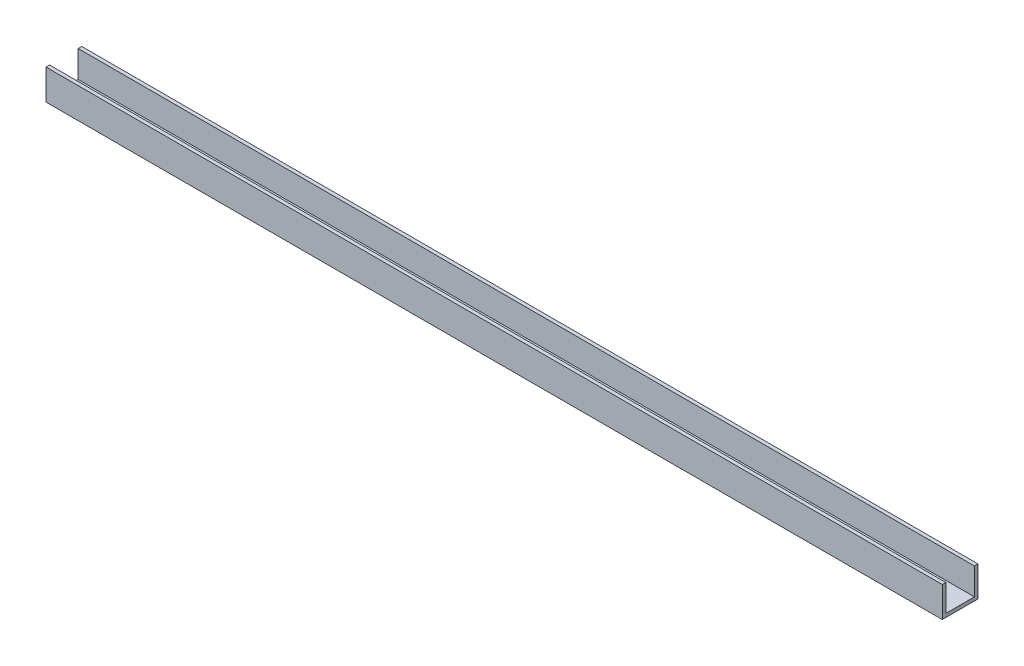
ISO-10303-21;
HEADER;
FILE_DESCRIPTION(('STEP AP214'),'2;1');
FILE_NAME('part.step','',(''),(''),'','','');
FILE_SCHEMA(('AUTOMOTIVE_DESIGN { 1 0 10303 214 1 1 1 1 }'));
ENDSEC;
DATA;
#1=APPLICATION_CONTEXT('core data for automotive mechanical design processes');
#2=APPLICATION_PROTOCOL_DEFINITION('international standard','automotive_design',2000,#1);
#3=PRODUCT_CONTEXT('',#1,'mechanical');
#4=PRODUCT('Part','Part','',(#3));
#5=PRODUCT_RELATED_PRODUCT_CATEGORY('part','',(#4));
#6=PRODUCT_DEFINITION_FORMATION('','',#4);
#7=PRODUCT_DEFINITION_CONTEXT('part definition',#1,'design');
#8=PRODUCT_DEFINITION('design','',#6,#7);
#9=PRODUCT_DEFINITION_SHAPE('','',#8);
#10=(LENGTH_UNIT() NAMED_UNIT(*) SI_UNIT(.MILLI.,.METRE.));
#11=(NAMED_UNIT(*) PLANE_ANGLE_UNIT() SI_UNIT($,.RADIAN.));
#12=(NAMED_UNIT(*) SI_UNIT($,.STERADIAN.) SOLID_ANGLE_UNIT());
#13=UNCERTAINTY_MEASURE_WITH_UNIT(LENGTH_MEASURE(1.E-05),#10,'distance_accuracy_value','');
#14=(GEOMETRIC_REPRESENTATION_CONTEXT(3) GLOBAL_UNCERTAINTY_ASSIGNED_CONTEXT((#13)) GLOBAL_UNIT_ASSIGNED_CONTEXT((#10,
#11,#12)) REPRESENTATION_CONTEXT('',''));
#15=CARTESIAN_POINT('',(0.,0.,0.));
#16=DIRECTION('',(0.,0.,1.));
#17=DIRECTION('',(1.,0.,0.));
#18=AXIS2_PLACEMENT_3D('',#15,#16,#17);
#19=CARTESIAN_POINT('',(251.,4.25,4.));
#20=DIRECTION('',(0.,-1.,0.));
#21=DIRECTION('',(0.,0.,-1.));
#22=AXIS2_PLACEMENT_3D('',#19,#20,#21);
#23=PLANE('',#22);
#24=DIRECTION('',(0.,0.,1.));
#25=VECTOR('',#24,1.);
#26=CARTESIAN_POINT('',(0.,4.25,4.));
#27=LINE('',#26,#25);
#28=CARTESIAN_POINT('',(0.,4.25,4.));
#29=VERTEX_POINT('',#28);
#30=CARTESIAN_POINT('',(0.,4.25,5.));
#31=VERTEX_POINT('',#30);
#32=EDGE_CURVE('E126',#29,#31,#27,.T.);
#33=ORIENTED_EDGE('',*,*,#32,.T.);
#34=DIRECTION('',(-1.,0.,0.));
#35=VECTOR('',#34,1.);
#36=CARTESIAN_POINT('',(251.,4.25,5.));
#37=LINE('',#36,#35);
#38=CARTESIAN_POINT('',(251.,4.25,5.));
#39=VERTEX_POINT('',#38);
#40=EDGE_CURVE('E11',#39,#31,#37,.T.);
#41=ORIENTED_EDGE('',*,*,#40,.F.);
#42=DIRECTION('',(0.,0.,1.));
#43=VECTOR('',#42,1.);
#44=CARTESIAN_POINT('',(251.,4.25,4.));
#45=LINE('',#44,#43);
#46=CARTESIAN_POINT('',(251.,4.25,4.));
#47=VERTEX_POINT('',#46);
#48=EDGE_CURVE('E141',#47,#39,#45,.T.);
#49=ORIENTED_EDGE('',*,*,#48,.F.);
#50=DIRECTION('',(-1.,0.,0.));
#51=VECTOR('',#50,1.);
#52=CARTESIAN_POINT('',(251.,4.25,4.));
#53=LINE('',#52,#51);
#54=EDGE_CURVE('E122',#47,#29,#53,.T.);
#55=ORIENTED_EDGE('',*,*,#54,.T.);
#56=EDGE_LOOP('',(#33,#41,#49,#55));
#57=FACE_BOUND('',#56,.T.);
#58=ADVANCED_FACE('F30',(#57),#23,.F.);
#59=CARTESIAN_POINT('',(251.,-4.25,5.));
#60=DIRECTION('',(0.,0.,-1.));
#61=DIRECTION('',(-1.,0.,0.));
#62=AXIS2_PLACEMENT_3D('',#59,#60,#61);
#63=PLANE('',#62);
#64=DIRECTION('',(0.,-1.,0.));
#65=VECTOR('',#64,1.);
#66=CARTESIAN_POINT('',(0.,-4.25,5.));
#67=LINE('',#66,#65);
#68=CARTESIAN_POINT('',(0.,-4.25,5.));
#69=VERTEX_POINT('',#68);
#70=EDGE_CURVE('E129',#31,#69,#67,.T.);
#71=ORIENTED_EDGE('',*,*,#70,.T.);
#72=DIRECTION('',(-1.,0.,0.));
#73=VECTOR('',#72,1.);
#74=CARTESIAN_POINT('',(251.,-4.25,5.));
#75=LINE('',#74,#73);
#76=CARTESIAN_POINT('',(251.,-4.25,5.));
#77=VERTEX_POINT('',#76);
#78=EDGE_CURVE('E38',#77,#69,#75,.T.);
#79=ORIENTED_EDGE('',*,*,#78,.F.);
#80=DIRECTION('',(0.,-1.,0.));
#81=VECTOR('',#80,1.);
#82=CARTESIAN_POINT('',(251.,-4.25,5.));
#83=LINE('',#82,#81);
#84=EDGE_CURVE('E89',#39,#77,#83,.T.);
#85=ORIENTED_EDGE('',*,*,#84,.F.);
#86=ORIENTED_EDGE('',*,*,#40,.T.);
#87=EDGE_LOOP('',(#71,#79,#85,#86));
#88=FACE_BOUND('',#87,.T.);
#89=ADVANCED_FACE('F233',(#88),#63,.F.);
#90=CARTESIAN_POINT('',(251.,-4.25,-5.));
#91=DIRECTION('',(0.,1.,0.));
#92=DIRECTION('',(0.,0.,1.));
#93=AXIS2_PLACEMENT_3D('',#90,#91,#92);
#94=PLANE('',#93);
#95=CARTESIAN_POINT('',(215.,-4.25,0.));
#96=DIRECTION('',(0.,-1.,0.));
#97=DIRECTION('',(0.,0.,-1.));
#98=AXIS2_PLACEMENT_3D('',#95,#96,#97);
#99=CIRCLE('',#98,2.5);
#100=CARTESIAN_POINT('',(215.,-4.25,-2.49999999999999));
#101=VERTEX_POINT('',#100);
#102=EDGE_CURVE('E224',#101,#101,#99,.T.);
#103=ORIENTED_EDGE('',*,*,#102,.F.);
#104=EDGE_LOOP('',(#103));
#105=FACE_BOUND('',#104,.T.);
#106=CARTESIAN_POINT('',(223.5,-4.25,0.));
#107=DIRECTION('',(0.,-1.,0.));
#108=DIRECTION('',(0.,0.,-1.));
#109=AXIS2_PLACEMENT_3D('',#106,#107,#108);
#110=CIRCLE('',#109,2.5);
#111=CARTESIAN_POINT('',(223.5,-4.25,-2.49999999999999));
#112=VERTEX_POINT('',#111);
#113=EDGE_CURVE('E218',#112,#112,#110,.T.);
#114=ORIENTED_EDGE('',*,*,#113,.F.);
#115=EDGE_LOOP('',(#114));
#116=FACE_BOUND('',#115,.T.);
#117=CARTESIAN_POINT('',(232.,-4.25,0.));
#118=DIRECTION('',(0.,-1.,0.));
#119=DIRECTION('',(0.,0.,-1.));
#120=AXIS2_PLACEMENT_3D('',#117,#118,#119);
#121=CIRCLE('',#120,2.5);
#122=CARTESIAN_POINT('',(232.,-4.25,-2.49999999999999));
#123=VERTEX_POINT('',#122);
#124=EDGE_CURVE('E212',#123,#123,#121,.T.);
#125=ORIENTED_EDGE('',*,*,#124,.F.);
#126=EDGE_LOOP('',(#125));
#127=FACE_BOUND('',#126,.T.);
#128=CARTESIAN_POINT('',(132.,-4.25,0.));
#129=DIRECTION('',(0.,-1.,0.));
#130=DIRECTION('',(0.,0.,-1.));
#131=AXIS2_PLACEMENT_3D('',#128,#129,#130);
#132=CIRCLE('',#131,2.5);
#133=CARTESIAN_POINT('',(132.,-4.25,-2.5));
#134=VERTEX_POINT('',#133);
#135=EDGE_CURVE('E206',#134,#134,#132,.T.);
#136=ORIENTED_EDGE('',*,*,#135,.F.);
#137=EDGE_LOOP('',(#136));
#138=FACE_BOUND('',#137,.T.);
#139=CARTESIAN_POINT('',(123.5,-4.25,0.));
#140=DIRECTION('',(0.,-1.,0.));
#141=DIRECTION('',(0.,0.,-1.));
#142=AXIS2_PLACEMENT_3D('',#139,#140,#141);
#143=CIRCLE('',#142,2.49999999999997);
#144=CARTESIAN_POINT('',(123.5,-4.25,-2.49999999999997));
#145=VERTEX_POINT('',#144);
#146=EDGE_CURVE('E200',#145,#145,#143,.T.);
#147=ORIENTED_EDGE('',*,*,#146,.F.);
#148=EDGE_LOOP('',(#147));
#149=FACE_BOUND('',#148,.T.);
#150=CARTESIAN_POINT('',(115.,-4.25,0.));
#151=DIRECTION('',(0.,-1.,0.));
#152=DIRECTION('',(0.,0.,-1.));
#153=AXIS2_PLACEMENT_3D('',#150,#151,#152);
#154=CIRCLE('',#153,2.50000000000001);
#155=CARTESIAN_POINT('',(115.,-4.25,-2.50000000000001));
#156=VERTEX_POINT('',#155);
#157=EDGE_CURVE('E194',#156,#156,#154,.T.);
#158=ORIENTED_EDGE('',*,*,#157,.F.);
#159=EDGE_LOOP('',(#158));
#160=FACE_BOUND('',#159,.T.);
#161=CARTESIAN_POINT('',(36.,-4.25,0.));
#162=DIRECTION('',(0.,-1.,0.));
#163=DIRECTION('',(0.,0.,-1.));
#164=AXIS2_PLACEMENT_3D('',#161,#162,#163);
#165=CIRCLE('',#164,2.5);
#166=CARTESIAN_POINT('',(36.,-4.25,-2.5));
#167=VERTEX_POINT('',#166);
#168=EDGE_CURVE('E188',#167,#167,#165,.T.);
#169=ORIENTED_EDGE('',*,*,#168,.F.);
#170=EDGE_LOOP('',(#169));
#171=FACE_BOUND('',#170,.T.);
#172=CARTESIAN_POINT('',(27.5,-4.25,0.));
#173=DIRECTION('',(0.,-1.,0.));
#174=DIRECTION('',(0.,0.,-1.));
#175=AXIS2_PLACEMENT_3D('',#172,#173,#174);
#176=CIRCLE('',#175,2.5);
#177=CARTESIAN_POINT('',(27.5,-4.25,-2.5));
#178=VERTEX_POINT('',#177);
#179=EDGE_CURVE('E182',#178,#178,#176,.T.);
#180=ORIENTED_EDGE('',*,*,#179,.F.);
#181=EDGE_LOOP('',(#180));
#182=FACE_BOUND('',#181,.T.);
#183=CARTESIAN_POINT('',(19.,-4.25,0.));
#184=DIRECTION('',(0.,-1.,0.));
#185=DIRECTION('',(0.,0.,-1.));
#186=AXIS2_PLACEMENT_3D('',#183,#184,#185);
#187=CIRCLE('',#186,2.5);
#188=CARTESIAN_POINT('',(19.,-4.25,-2.5));
#189=VERTEX_POINT('',#188);
#190=EDGE_CURVE('E176',#189,#189,#187,.T.);
#191=ORIENTED_EDGE('',*,*,#190,.F.);
#192=EDGE_LOOP('',(#191));
#193=FACE_BOUND('',#192,.T.);
#194=DIRECTION('',(0.,0.,-1.));
#195=VECTOR('',#194,1.);
#196=CARTESIAN_POINT('',(0.,-4.25,-5.));
#197=LINE('',#196,#195);
#198=CARTESIAN_POINT('',(0.,-4.25,-5.));
#199=VERTEX_POINT('',#198);
#200=EDGE_CURVE('E132',#69,#199,#197,.T.);
#201=ORIENTED_EDGE('',*,*,#200,.T.);
#202=DIRECTION('',(-1.,0.,0.));
#203=VECTOR('',#202,1.);
#204=CARTESIAN_POINT('',(251.,-4.25,-5.));
#205=LINE('',#204,#203);
#206=CARTESIAN_POINT('',(251.,-4.25,-5.));
#207=VERTEX_POINT('',#206);
#208=EDGE_CURVE('E148',#207,#199,#205,.T.);
#209=ORIENTED_EDGE('',*,*,#208,.F.);
#210=DIRECTION('',(0.,0.,-1.));
#211=VECTOR('',#210,1.);
#212=CARTESIAN_POINT('',(251.,-4.25,-5.));
#213=LINE('',#212,#211);
#214=EDGE_CURVE('E156',#77,#207,#213,.T.);
#215=ORIENTED_EDGE('',*,*,#214,.F.);
#216=ORIENTED_EDGE('',*,*,#78,.T.);
#217=EDGE_LOOP('',(#201,#209,#215,#216));
#218=FACE_BOUND('',#217,.T.);
#219=ADVANCED_FACE('F154',(#105,#116,#127,#138,#149,#160,#171,#182,#193,#218),#94,.F.);
#220=CARTESIAN_POINT('',(251.,-4.25,-5.));
#221=DIRECTION('',(0.,0.,1.));
#222=DIRECTION('',(1.,0.,0.));
#223=AXIS2_PLACEMENT_3D('',#220,#221,#222);
#224=PLANE('',#223);
#225=DIRECTION('',(0.,1.,0.));
#226=VECTOR('',#225,1.);
#227=CARTESIAN_POINT('',(0.,-4.25,-5.));
#228=LINE('',#227,#226);
#229=CARTESIAN_POINT('',(0.,4.25,-5.));
#230=VERTEX_POINT('',#229);
#231=EDGE_CURVE('E134',#199,#230,#228,.T.);
#232=ORIENTED_EDGE('',*,*,#231,.T.);
#233=DIRECTION('',(-1.,0.,0.));
#234=VECTOR('',#233,1.);
#235=CARTESIAN_POINT('',(251.,4.25,-5.));
#236=LINE('',#235,#234);
#237=CARTESIAN_POINT('',(251.,4.25,-5.));
#238=VERTEX_POINT('',#237);
#239=EDGE_CURVE('E145',#238,#230,#236,.T.);
#240=ORIENTED_EDGE('',*,*,#239,.F.);
#241=DIRECTION('',(0.,1.,0.));
#242=VECTOR('',#241,1.);
#243=CARTESIAN_POINT('',(251.,-4.25,-5.));
#244=LINE('',#243,#242);
#245=EDGE_CURVE('E168',#207,#238,#244,.T.);
#246=ORIENTED_EDGE('',*,*,#245,.F.);
#247=ORIENTED_EDGE('',*,*,#208,.T.);
#248=EDGE_LOOP('',(#232,#240,#246,#247));
#249=FACE_BOUND('',#248,.T.);
#250=ADVANCED_FACE('F164',(#249),#224,.F.);
#251=CARTESIAN_POINT('',(251.,4.25,-5.));
#252=DIRECTION('',(0.,-1.,0.));
#253=DIRECTION('',(0.,0.,-1.));
#254=AXIS2_PLACEMENT_3D('',#251,#252,#253);
#255=PLANE('',#254);
#256=DIRECTION('',(0.,0.,1.));
#257=VECTOR('',#256,1.);
#258=CARTESIAN_POINT('',(0.,4.25,-5.));
#259=LINE('',#258,#257);
#260=CARTESIAN_POINT('',(0.,4.25,-4.));
#261=VERTEX_POINT('',#260);
#262=EDGE_CURVE('E136',#230,#261,#259,.T.);
#263=ORIENTED_EDGE('',*,*,#262,.T.);
#264=DIRECTION('',(-1.,0.,0.));
#265=VECTOR('',#264,1.);
#266=CARTESIAN_POINT('',(251.,4.25,-4.));
#267=LINE('',#266,#265);
#268=CARTESIAN_POINT('',(251.,4.25,-4.));
#269=VERTEX_POINT('',#268);
#270=EDGE_CURVE('E117',#269,#261,#267,.T.);
#271=ORIENTED_EDGE('',*,*,#270,.F.);
#272=DIRECTION('',(0.,0.,1.));
#273=VECTOR('',#272,1.);
#274=CARTESIAN_POINT('',(251.,4.25,-5.));
#275=LINE('',#274,#273);
#276=EDGE_CURVE('E108',#238,#269,#275,.T.);
#277=ORIENTED_EDGE('',*,*,#276,.F.);
#278=ORIENTED_EDGE('',*,*,#239,.T.);
#279=EDGE_LOOP('',(#263,#271,#277,#278));
#280=FACE_BOUND('',#279,.T.);
#281=ADVANCED_FACE('F167',(#280),#255,.F.);
#282=CARTESIAN_POINT('',(251.,-3.25,-4.));
#283=DIRECTION('',(0.,0.,-1.));
#284=DIRECTION('',(-1.,0.,0.));
#285=AXIS2_PLACEMENT_3D('',#282,#283,#284);
#286=PLANE('',#285);
#287=DIRECTION('',(0.,-1.,0.));
#288=VECTOR('',#287,1.);
#289=CARTESIAN_POINT('',(0.,-3.25,-4.));
#290=LINE('',#289,#288);
#291=CARTESIAN_POINT('',(0.,-3.25,-4.));
#292=VERTEX_POINT('',#291);
#293=EDGE_CURVE('E116',#261,#292,#290,.T.);
#294=ORIENTED_EDGE('',*,*,#293,.T.);
#295=DIRECTION('',(-1.,0.,0.));
#296=VECTOR('',#295,1.);
#297=CARTESIAN_POINT('',(251.,-3.25,-4.));
#298=LINE('',#297,#296);
#299=CARTESIAN_POINT('',(251.,-3.25,-4.));
#300=VERTEX_POINT('',#299);
#301=EDGE_CURVE('E113',#300,#292,#298,.T.);
#302=ORIENTED_EDGE('',*,*,#301,.F.);
#303=DIRECTION('',(0.,-1.,0.));
#304=VECTOR('',#303,1.);
#305=CARTESIAN_POINT('',(251.,-3.25,-4.));
#306=LINE('',#305,#304);
#307=EDGE_CURVE('E102',#269,#300,#306,.T.);
#308=ORIENTED_EDGE('',*,*,#307,.F.);
#309=ORIENTED_EDGE('',*,*,#270,.T.);
#310=EDGE_LOOP('',(#294,#302,#308,#309));
#311=FACE_BOUND('',#310,.T.);
#312=ADVANCED_FACE('F114',(#311),#286,.F.);
#313=CARTESIAN_POINT('',(251.,-3.25,4.));
#314=DIRECTION('',(0.,-1.,0.));
#315=DIRECTION('',(0.,0.,-1.));
#316=AXIS2_PLACEMENT_3D('',#313,#314,#315);
#317=PLANE('',#316);
#318=CARTESIAN_POINT('',(215.,-3.25,0.));
#319=DIRECTION('',(0.,-1.,0.));
#320=DIRECTION('',(0.,0.,-1.));
#321=AXIS2_PLACEMENT_3D('',#318,#319,#320);
#322=CIRCLE('',#321,2.5);
#323=CARTESIAN_POINT('',(215.,-3.25,-2.49999999999999));
#324=VERTEX_POINT('',#323);
#325=EDGE_CURVE('E221',#324,#324,#322,.F.);
#326=ORIENTED_EDGE('',*,*,#325,.F.);
#327=EDGE_LOOP('',(#326));
#328=FACE_BOUND('',#327,.T.);
#329=CARTESIAN_POINT('',(223.5,-3.25,0.));
#330=DIRECTION('',(0.,-1.,0.));
#331=DIRECTION('',(0.,0.,-1.));
#332=AXIS2_PLACEMENT_3D('',#329,#330,#331);
#333=CIRCLE('',#332,2.5);
#334=CARTESIAN_POINT('',(223.5,-3.25,-2.49999999999999));
#335=VERTEX_POINT('',#334);
#336=EDGE_CURVE('E215',#335,#335,#333,.F.);
#337=ORIENTED_EDGE('',*,*,#336,.F.);
#338=EDGE_LOOP('',(#337));
#339=FACE_BOUND('',#338,.T.);
#340=CARTESIAN_POINT('',(232.,-3.25,0.));
#341=DIRECTION('',(0.,-1.,0.));
#342=DIRECTION('',(0.,0.,-1.));
#343=AXIS2_PLACEMENT_3D('',#340,#341,#342);
#344=CIRCLE('',#343,2.5);
#345=CARTESIAN_POINT('',(232.,-3.25,-2.49999999999999));
#346=VERTEX_POINT('',#345);
#347=EDGE_CURVE('E209',#346,#346,#344,.F.);
#348=ORIENTED_EDGE('',*,*,#347,.F.);
#349=EDGE_LOOP('',(#348));
#350=FACE_BOUND('',#349,.T.);
#351=CARTESIAN_POINT('',(132.,-3.25,0.));
#352=DIRECTION('',(0.,-1.,0.));
#353=DIRECTION('',(0.,0.,-1.));
#354=AXIS2_PLACEMENT_3D('',#351,#352,#353);
#355=CIRCLE('',#354,2.5);
#356=CARTESIAN_POINT('',(132.,-3.25,-2.5));
#357=VERTEX_POINT('',#356);
#358=EDGE_CURVE('E203',#357,#357,#355,.F.);
#359=ORIENTED_EDGE('',*,*,#358,.F.);
#360=EDGE_LOOP('',(#359));
#361=FACE_BOUND('',#360,.T.);
#362=CARTESIAN_POINT('',(123.5,-3.25,0.));
#363=DIRECTION('',(0.,-1.,0.));
#364=DIRECTION('',(0.,0.,-1.));
#365=AXIS2_PLACEMENT_3D('',#362,#363,#364);
#366=CIRCLE('',#365,2.49999999999997);
#367=CARTESIAN_POINT('',(123.5,-3.25,-2.49999999999997));
#368=VERTEX_POINT('',#367);
#369=EDGE_CURVE('E197',#368,#368,#366,.F.);
#370=ORIENTED_EDGE('',*,*,#369,.F.);
#371=EDGE_LOOP('',(#370));
#372=FACE_BOUND('',#371,.T.);
#373=CARTESIAN_POINT('',(115.,-3.25,0.));
#374=DIRECTION('',(0.,-1.,0.));
#375=DIRECTION('',(0.,0.,-1.));
#376=AXIS2_PLACEMENT_3D('',#373,#374,#375);
#377=CIRCLE('',#376,2.50000000000001);
#378=CARTESIAN_POINT('',(115.,-3.25,-2.50000000000001));
#379=VERTEX_POINT('',#378);
#380=EDGE_CURVE('E191',#379,#379,#377,.F.);
#381=ORIENTED_EDGE('',*,*,#380,.F.);
#382=EDGE_LOOP('',(#381));
#383=FACE_BOUND('',#382,.T.);
#384=CARTESIAN_POINT('',(36.,-3.25,0.));
#385=DIRECTION('',(0.,-1.,0.));
#386=DIRECTION('',(0.,0.,-1.));
#387=AXIS2_PLACEMENT_3D('',#384,#385,#386);
#388=CIRCLE('',#387,2.5);
#389=CARTESIAN_POINT('',(36.,-3.25,-2.5));
#390=VERTEX_POINT('',#389);
#391=EDGE_CURVE('E185',#390,#390,#388,.F.);
#392=ORIENTED_EDGE('',*,*,#391,.F.);
#393=EDGE_LOOP('',(#392));
#394=FACE_BOUND('',#393,.T.);
#395=CARTESIAN_POINT('',(27.5,-3.25,0.));
#396=DIRECTION('',(0.,-1.,0.));
#397=DIRECTION('',(0.,0.,-1.));
#398=AXIS2_PLACEMENT_3D('',#395,#396,#397);
#399=CIRCLE('',#398,2.5);
#400=CARTESIAN_POINT('',(27.5,-3.25,-2.5));
#401=VERTEX_POINT('',#400);
#402=EDGE_CURVE('E179',#401,#401,#399,.F.);
#403=ORIENTED_EDGE('',*,*,#402,.F.);
#404=EDGE_LOOP('',(#403));
#405=FACE_BOUND('',#404,.T.);
#406=CARTESIAN_POINT('',(19.,-3.25,0.));
#407=DIRECTION('',(0.,-1.,0.));
#408=DIRECTION('',(0.,0.,-1.));
#409=AXIS2_PLACEMENT_3D('',#406,#407,#408);
#410=CIRCLE('',#409,2.5);
#411=CARTESIAN_POINT('',(19.,-3.25,-2.5));
#412=VERTEX_POINT('',#411);
#413=EDGE_CURVE('E130',#412,#412,#410,.F.);
#414=ORIENTED_EDGE('',*,*,#413,.F.);
#415=EDGE_LOOP('',(#414));
#416=FACE_BOUND('',#415,.T.);
#417=DIRECTION('',(0.,0.,1.));
#418=VECTOR('',#417,1.);
#419=CARTESIAN_POINT('',(0.,-3.25,4.));
#420=LINE('',#419,#418);
#421=CARTESIAN_POINT('',(0.,-3.25,4.));
#422=VERTEX_POINT('',#421);
#423=EDGE_CURVE('E75',#292,#422,#420,.T.);
#424=ORIENTED_EDGE('',*,*,#423,.T.);
#425=DIRECTION('',(-1.,0.,0.));
#426=VECTOR('',#425,1.);
#427=CARTESIAN_POINT('',(251.,-3.25,4.));
#428=LINE('',#427,#426);
#429=CARTESIAN_POINT('',(251.,-3.25,4.));
#430=VERTEX_POINT('',#429);
#431=EDGE_CURVE('E118',#430,#422,#428,.T.);
#432=ORIENTED_EDGE('',*,*,#431,.F.);
#433=DIRECTION('',(0.,0.,1.));
#434=VECTOR('',#433,1.);
#435=CARTESIAN_POINT('',(251.,-3.25,4.));
#436=LINE('',#435,#434);
#437=EDGE_CURVE('E106',#300,#430,#436,.T.);
#438=ORIENTED_EDGE('',*,*,#437,.F.);
#439=ORIENTED_EDGE('',*,*,#301,.T.);
#440=EDGE_LOOP('',(#424,#432,#438,#439));
#441=FACE_BOUND('',#440,.T.);
#442=ADVANCED_FACE('F120',(#328,#339,#350,#361,#372,#383,#394,#405,#416,#441),#317,.F.);
#443=CARTESIAN_POINT('',(251.,4.25,4.));
#444=DIRECTION('',(0.,0.,1.));
#445=DIRECTION('',(0.,-1.,0.));
#446=AXIS2_PLACEMENT_3D('',#443,#444,#445);
#447=PLANE('',#446);
#448=DIRECTION('',(0.,1.,0.));
#449=VECTOR('',#448,1.);
#450=CARTESIAN_POINT('',(0.,4.25,4.));
#451=LINE('',#450,#449);
#452=EDGE_CURVE('E81',#422,#29,#451,.T.);
#453=ORIENTED_EDGE('',*,*,#452,.T.);
#454=ORIENTED_EDGE('',*,*,#54,.F.);
#455=DIRECTION('',(0.,1.,0.));
#456=VECTOR('',#455,1.);
#457=CARTESIAN_POINT('',(251.,4.25,4.));
#458=LINE('',#457,#456);
#459=EDGE_CURVE('E46',#430,#47,#458,.T.);
#460=ORIENTED_EDGE('',*,*,#459,.F.);
#461=ORIENTED_EDGE('',*,*,#431,.T.);
#462=EDGE_LOOP('',(#453,#454,#460,#461));
#463=FACE_BOUND('',#462,.T.);
#464=ADVANCED_FACE('F259',(#463),#447,.F.);
#465=CARTESIAN_POINT('',(251.,4.25,5.));
#466=DIRECTION('',(-1.,0.,0.));
#467=DIRECTION('',(0.,0.,1.));
#468=AXIS2_PLACEMENT_3D('',#465,#466,#467);
#469=PLANE('',#468);
#470=ORIENTED_EDGE('',*,*,#48,.T.);
#471=ORIENTED_EDGE('',*,*,#84,.T.);
#472=ORIENTED_EDGE('',*,*,#214,.T.);
#473=ORIENTED_EDGE('',*,*,#245,.T.);
#474=ORIENTED_EDGE('',*,*,#276,.T.);
#475=ORIENTED_EDGE('',*,*,#307,.T.);
#476=ORIENTED_EDGE('',*,*,#437,.T.);
#477=ORIENTED_EDGE('',*,*,#459,.T.);
#478=EDGE_LOOP('',(#470,#471,#472,#473,#474,#475,#476,#477));
#479=FACE_BOUND('',#478,.T.);
#480=ADVANCED_FACE('F104',(#479),#469,.F.);
#481=CARTESIAN_POINT('',(0.,4.25,5.));
#482=DIRECTION('',(-1.,0.,0.));
#483=DIRECTION('',(0.,0.,1.));
#484=AXIS2_PLACEMENT_3D('',#481,#482,#483);
#485=PLANE('',#484);
#486=ORIENTED_EDGE('',*,*,#32,.F.);
#487=ORIENTED_EDGE('',*,*,#452,.F.);
#488=ORIENTED_EDGE('',*,*,#423,.F.);
#489=ORIENTED_EDGE('',*,*,#293,.F.);
#490=ORIENTED_EDGE('',*,*,#262,.F.);
#491=ORIENTED_EDGE('',*,*,#231,.F.);
#492=ORIENTED_EDGE('',*,*,#200,.F.);
#493=ORIENTED_EDGE('',*,*,#70,.F.);
#494=EDGE_LOOP('',(#486,#487,#488,#489,#490,#491,#492,#493));
#495=FACE_BOUND('',#494,.T.);
#496=ADVANCED_FACE('F160',(#495),#485,.T.);
#497=CARTESIAN_POINT('',(19.,4.251,0.));
#498=DIRECTION('',(0.,-1.,0.));
#499=DIRECTION('',(0.,0.,-1.));
#500=AXIS2_PLACEMENT_3D('',#497,#498,#499);
#501=CYLINDRICAL_SURFACE('',#500,2.5);
#502=ORIENTED_EDGE('',*,*,#190,.T.);
#503=EDGE_LOOP('',(#502));
#504=FACE_BOUND('',#503,.T.);
#505=ORIENTED_EDGE('',*,*,#413,.T.);
#506=EDGE_LOOP('',(#505));
#507=FACE_BOUND('',#506,.T.);
#508=ADVANCED_FACE('F251',(#504,#507),#501,.F.);
#509=CARTESIAN_POINT('',(27.5,4.251,0.));
#510=DIRECTION('',(0.,-1.,0.));
#511=DIRECTION('',(0.,0.,-1.));
#512=AXIS2_PLACEMENT_3D('',#509,#510,#511);
#513=CYLINDRICAL_SURFACE('',#512,2.5);
#514=ORIENTED_EDGE('',*,*,#179,.T.);
#515=EDGE_LOOP('',(#514));
#516=FACE_BOUND('',#515,.T.);
#517=ORIENTED_EDGE('',*,*,#402,.T.);
#518=EDGE_LOOP('',(#517));
#519=FACE_BOUND('',#518,.T.);
#520=ADVANCED_FACE('F254',(#516,#519),#513,.F.);
#521=CARTESIAN_POINT('',(36.,4.251,0.));
#522=DIRECTION('',(0.,-1.,0.));
#523=DIRECTION('',(0.,0.,-1.));
#524=AXIS2_PLACEMENT_3D('',#521,#522,#523);
#525=CYLINDRICAL_SURFACE('',#524,2.5);
#526=ORIENTED_EDGE('',*,*,#168,.T.);
#527=EDGE_LOOP('',(#526));
#528=FACE_BOUND('',#527,.T.);
#529=ORIENTED_EDGE('',*,*,#391,.T.);
#530=EDGE_LOOP('',(#529));
#531=FACE_BOUND('',#530,.T.);
#532=ADVANCED_FACE('F340',(#528,#531),#525,.F.);
#533=CARTESIAN_POINT('',(115.,4.251,0.));
#534=DIRECTION('',(0.,-1.,0.));
#535=DIRECTION('',(0.,0.,-1.));
#536=AXIS2_PLACEMENT_3D('',#533,#534,#535);
#537=CYLINDRICAL_SURFACE('',#536,2.50000000000001);
#538=ORIENTED_EDGE('',*,*,#157,.T.);
#539=EDGE_LOOP('',(#538));
#540=FACE_BOUND('',#539,.T.);
#541=ORIENTED_EDGE('',*,*,#380,.T.);
#542=EDGE_LOOP('',(#541));
#543=FACE_BOUND('',#542,.T.);
#544=ADVANCED_FACE('F350',(#540,#543),#537,.F.);
#545=CARTESIAN_POINT('',(123.5,4.251,0.));
#546=DIRECTION('',(0.,-1.,0.));
#547=DIRECTION('',(0.,0.,-1.));
#548=AXIS2_PLACEMENT_3D('',#545,#546,#547);
#549=CYLINDRICAL_SURFACE('',#548,2.49999999999997);
#550=ORIENTED_EDGE('',*,*,#146,.T.);
#551=EDGE_LOOP('',(#550));
#552=FACE_BOUND('',#551,.T.);
#553=ORIENTED_EDGE('',*,*,#369,.T.);
#554=EDGE_LOOP('',(#553));
#555=FACE_BOUND('',#554,.T.);
#556=ADVANCED_FACE('F360',(#552,#555),#549,.F.);
#557=CARTESIAN_POINT('',(132.,4.251,0.));
#558=DIRECTION('',(0.,-1.,0.));
#559=DIRECTION('',(0.,0.,-1.));
#560=AXIS2_PLACEMENT_3D('',#557,#558,#559);
#561=CYLINDRICAL_SURFACE('',#560,2.5);
#562=ORIENTED_EDGE('',*,*,#135,.T.);
#563=EDGE_LOOP('',(#562));
#564=FACE_BOUND('',#563,.T.);
#565=ORIENTED_EDGE('',*,*,#358,.T.);
#566=EDGE_LOOP('',(#565));
#567=FACE_BOUND('',#566,.T.);
#568=ADVANCED_FACE('F370',(#564,#567),#561,.F.);
#569=CARTESIAN_POINT('',(232.,4.251,0.));
#570=DIRECTION('',(0.,-1.,0.));
#571=DIRECTION('',(0.,0.,-1.));
#572=AXIS2_PLACEMENT_3D('',#569,#570,#571);
#573=CYLINDRICAL_SURFACE('',#572,2.5);
#574=ORIENTED_EDGE('',*,*,#124,.T.);
#575=EDGE_LOOP('',(#574));
#576=FACE_BOUND('',#575,.T.);
#577=ORIENTED_EDGE('',*,*,#347,.T.);
#578=EDGE_LOOP('',(#577));
#579=FACE_BOUND('',#578,.T.);
#580=ADVANCED_FACE('F380',(#576,#579),#573,.F.);
#581=CARTESIAN_POINT('',(223.5,4.251,0.));
#582=DIRECTION('',(0.,-1.,0.));
#583=DIRECTION('',(0.,0.,-1.));
#584=AXIS2_PLACEMENT_3D('',#581,#582,#583);
#585=CYLINDRICAL_SURFACE('',#584,2.5);
#586=ORIENTED_EDGE('',*,*,#113,.T.);
#587=EDGE_LOOP('',(#586));
#588=FACE_BOUND('',#587,.T.);
#589=ORIENTED_EDGE('',*,*,#336,.T.);
#590=EDGE_LOOP('',(#589));
#591=FACE_BOUND('',#590,.T.);
#592=ADVANCED_FACE('F390',(#588,#591),#585,.F.);
#593=CARTESIAN_POINT('',(215.,4.251,0.));
#594=DIRECTION('',(0.,-1.,0.));
#595=DIRECTION('',(0.,0.,-1.));
#596=AXIS2_PLACEMENT_3D('',#593,#594,#595);
#597=CYLINDRICAL_SURFACE('',#596,2.5);
#598=ORIENTED_EDGE('',*,*,#102,.T.);
#599=EDGE_LOOP('',(#598));
#600=FACE_BOUND('',#599,.T.);
#601=ORIENTED_EDGE('',*,*,#325,.T.);
#602=EDGE_LOOP('',(#601));
#603=FACE_BOUND('',#602,.T.);
#604=ADVANCED_FACE('F228',(#600,#603),#597,.F.);
#605=CLOSED_SHELL('',(#58,#89,#219,#250,#281,#312,#442,#464,#480,#496,#508,#520,#532,#544,#556,
#568,#580,#592,#604));
#606=MANIFOLD_SOLID_BREP('B2',#605);
#607=ADVANCED_BREP_SHAPE_REPRESENTATION('',(#18,#606),#14);
#608=SHAPE_DEFINITION_REPRESENTATION(#9,#607);
ENDSEC;
END-ISO-10303-21;
